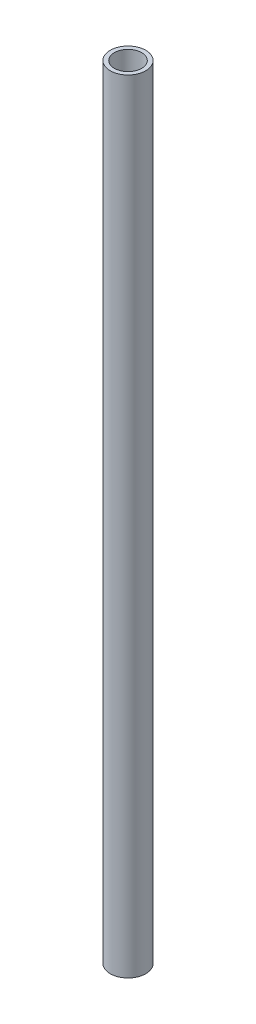
ISO-10303-21;
HEADER;
FILE_DESCRIPTION(('STEP AP214'),'2;1');
FILE_NAME('part.step','',(''),(''),'','','');
FILE_SCHEMA(('AUTOMOTIVE_DESIGN { 1 0 10303 214 1 1 1 1 }'));
ENDSEC;
DATA;
#1=APPLICATION_CONTEXT('core data for automotive mechanical design processes');
#2=APPLICATION_PROTOCOL_DEFINITION('international standard','automotive_design',2000,#1);
#3=PRODUCT_CONTEXT('',#1,'mechanical');
#4=PRODUCT('Part','Part','',(#3));
#5=PRODUCT_RELATED_PRODUCT_CATEGORY('part','',(#4));
#6=PRODUCT_DEFINITION_FORMATION('','',#4);
#7=PRODUCT_DEFINITION_CONTEXT('part definition',#1,'design');
#8=PRODUCT_DEFINITION('design','',#6,#7);
#9=PRODUCT_DEFINITION_SHAPE('','',#8);
#10=(LENGTH_UNIT() NAMED_UNIT(*) SI_UNIT(.MILLI.,.METRE.));
#11=(NAMED_UNIT(*) PLANE_ANGLE_UNIT() SI_UNIT($,.RADIAN.));
#12=(NAMED_UNIT(*) SI_UNIT($,.STERADIAN.) SOLID_ANGLE_UNIT());
#13=UNCERTAINTY_MEASURE_WITH_UNIT(LENGTH_MEASURE(1.E-05),#10,'distance_accuracy_value','');
#14=(GEOMETRIC_REPRESENTATION_CONTEXT(3) GLOBAL_UNCERTAINTY_ASSIGNED_CONTEXT((#13)) GLOBAL_UNIT_ASSIGNED_CONTEXT((#10,
#11,#12)) REPRESENTATION_CONTEXT('',''));
#15=CARTESIAN_POINT('',(0.,0.,0.));
#16=DIRECTION('',(0.,0.,1.));
#17=DIRECTION('',(1.,0.,0.));
#18=AXIS2_PLACEMENT_3D('',#15,#16,#17);
#19=CARTESIAN_POINT('',(0.,0.,0.));
#20=DIRECTION('',(0.,1.,0.));
#21=DIRECTION('',(0.,0.,1.));
#22=AXIS2_PLACEMENT_3D('',#19,#20,#21);
#23=PLANE('',#22);
#24=CARTESIAN_POINT('',(0.,0.,0.));
#25=DIRECTION('',(0.,1.,0.));
#26=DIRECTION('',(0.,0.,1.));
#27=AXIS2_PLACEMENT_3D('',#24,#25,#26);
#28=CIRCLE('',#27,6.35);
#29=CARTESIAN_POINT('',(0.,0.,6.35));
#30=VERTEX_POINT('',#29);
#31=EDGE_CURVE('E34',#30,#30,#28,.T.);
#32=ORIENTED_EDGE('',*,*,#31,.F.);
#33=EDGE_LOOP('',(#32));
#34=FACE_BOUND('',#33,.T.);
#35=CARTESIAN_POINT('',(0.,0.,0.));
#36=DIRECTION('',(0.,1.,0.));
#37=DIRECTION('',(0.,0.,1.));
#38=AXIS2_PLACEMENT_3D('',#35,#36,#37);
#39=CIRCLE('',#38,4.8768);
#40=CARTESIAN_POINT('',(0.,0.,4.8768));
#41=VERTEX_POINT('',#40);
#42=EDGE_CURVE('E44',#41,#41,#39,.T.);
#43=ORIENTED_EDGE('',*,*,#42,.T.);
#44=EDGE_LOOP('',(#43));
#45=FACE_BOUND('',#44,.T.);
#46=ADVANCED_FACE('F30',(#34,#45),#23,.F.);
#47=CARTESIAN_POINT('',(0.,297.483702242138,0.));
#48=DIRECTION('',(0.,-1.,0.));
#49=DIRECTION('',(0.,0.,-1.));
#50=AXIS2_PLACEMENT_3D('',#47,#48,#49);
#51=CYLINDRICAL_SURFACE('',#50,6.35);
#52=CARTESIAN_POINT('',(0.,279.52319,0.));
#53=DIRECTION('',(0.,-1.,0.));
#54=DIRECTION('',(-0.977549330328729,0.,-0.210706684217312));
#55=AXIS2_PLACEMENT_3D('',#52,#53,#54);
#56=CIRCLE('',#55,6.35);
#57=CARTESIAN_POINT('',(-6.20743824758743,279.52319,-1.33798744477993));
#58=VERTEX_POINT('',#57);
#59=EDGE_CURVE('E10',#58,#58,#56,.T.);
#60=ORIENTED_EDGE('',*,*,#59,.T.);
#61=EDGE_LOOP('',(#60));
#62=FACE_BOUND('',#61,.T.);
#63=ORIENTED_EDGE('',*,*,#31,.T.);
#64=EDGE_LOOP('',(#63));
#65=FACE_BOUND('',#64,.T.);
#66=ADVANCED_FACE('F32',(#62,#65),#51,.T.);
#67=CARTESIAN_POINT('',(0.,297.483702242138,0.));
#68=DIRECTION('',(0.,-1.,0.));
#69=DIRECTION('',(0.,0.,-1.));
#70=AXIS2_PLACEMENT_3D('',#67,#68,#69);
#71=CYLINDRICAL_SURFACE('',#70,4.8768);
#72=CARTESIAN_POINT('',(0.,279.52319,0.));
#73=DIRECTION('',(0.,-1.,0.));
#74=DIRECTION('',(-0.977549330328729,0.,-0.210706684217312));
#75=AXIS2_PLACEMENT_3D('',#72,#73,#74);
#76=CIRCLE('',#75,4.8768);
#77=CARTESIAN_POINT('',(-4.76731257414715,279.52319,-1.02757435759099));
#78=VERTEX_POINT('',#77);
#79=EDGE_CURVE('E38',#78,#78,#76,.T.);
#80=ORIENTED_EDGE('',*,*,#79,.F.);
#81=EDGE_LOOP('',(#80));
#82=FACE_BOUND('',#81,.T.);
#83=ORIENTED_EDGE('',*,*,#42,.F.);
#84=EDGE_LOOP('',(#83));
#85=FACE_BOUND('',#84,.T.);
#86=ADVANCED_FACE('F56',(#82,#85),#71,.F.);
#87=CARTESIAN_POINT('',(0.,279.52319,0.));
#88=DIRECTION('',(0.,-1.,0.));
#89=DIRECTION('',(-0.977549330328729,0.,-0.210706684217312));
#90=AXIS2_PLACEMENT_3D('',#87,#88,#89);
#91=PLANE('',#90);
#92=ORIENTED_EDGE('',*,*,#79,.T.);
#93=EDGE_LOOP('',(#92));
#94=FACE_BOUND('',#93,.T.);
#95=ORIENTED_EDGE('',*,*,#59,.F.);
#96=EDGE_LOOP('',(#95));
#97=FACE_BOUND('',#96,.T.);
#98=ADVANCED_FACE('F60',(#94,#97),#91,.F.);
#99=CLOSED_SHELL('',(#46,#66,#86,#98));
#100=MANIFOLD_SOLID_BREP('B2',#99);
#101=ADVANCED_BREP_SHAPE_REPRESENTATION('',(#18,#100),#14);
#102=SHAPE_DEFINITION_REPRESENTATION(#9,#101);
ENDSEC;
END-ISO-10303-21;
